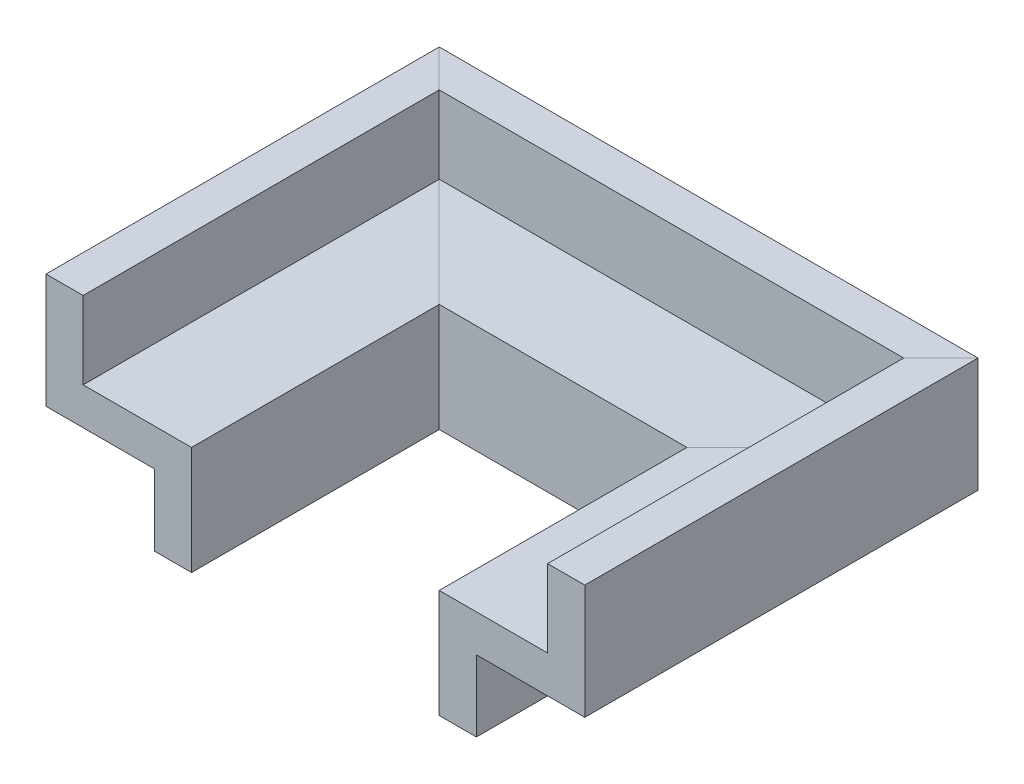
ISO-10303-21;
HEADER;
FILE_DESCRIPTION(('STEP AP214'),'2;1');
FILE_NAME('part.step','',(''),(''),'','','');
FILE_SCHEMA(('AUTOMOTIVE_DESIGN { 1 0 10303 214 1 1 1 1 }'));
ENDSEC;
DATA;
#1=APPLICATION_CONTEXT('core data for automotive mechanical design processes');
#2=APPLICATION_PROTOCOL_DEFINITION('international standard','automotive_design',2000,#1);
#3=PRODUCT_CONTEXT('',#1,'mechanical');
#4=PRODUCT('Part','Part','',(#3));
#5=PRODUCT_RELATED_PRODUCT_CATEGORY('part','',(#4));
#6=PRODUCT_DEFINITION_FORMATION('','',#4);
#7=PRODUCT_DEFINITION_CONTEXT('part definition',#1,'design');
#8=PRODUCT_DEFINITION('design','',#6,#7);
#9=PRODUCT_DEFINITION_SHAPE('','',#8);
#10=(LENGTH_UNIT() NAMED_UNIT(*) SI_UNIT(.MILLI.,.METRE.));
#11=(NAMED_UNIT(*) PLANE_ANGLE_UNIT() SI_UNIT($,.RADIAN.));
#12=(NAMED_UNIT(*) SI_UNIT($,.STERADIAN.) SOLID_ANGLE_UNIT());
#13=UNCERTAINTY_MEASURE_WITH_UNIT(LENGTH_MEASURE(1.E-05),#10,'distance_accuracy_value','');
#14=(GEOMETRIC_REPRESENTATION_CONTEXT(3) GLOBAL_UNCERTAINTY_ASSIGNED_CONTEXT((#13)) GLOBAL_UNIT_ASSIGNED_CONTEXT((#10,
#11,#12)) REPRESENTATION_CONTEXT('',''));
#15=CARTESIAN_POINT('',(0.,0.,0.));
#16=DIRECTION('',(0.,0.,1.));
#17=DIRECTION('',(1.,0.,0.));
#18=AXIS2_PLACEMENT_3D('',#15,#16,#17);
#19=CARTESIAN_POINT('',(80.,0.,0.));
#20=DIRECTION('',(0.,0.,-1.));
#21=DIRECTION('',(-1.,0.,0.));
#22=AXIS2_PLACEMENT_3D('',#19,#20,#21);
#23=PLANE('',#22);
#24=DIRECTION('',(-1.,0.,0.));
#25=VECTOR('',#24,1.);
#26=CARTESIAN_POINT('',(92.,0.,0.));
#27=LINE('',#26,#25);
#28=CARTESIAN_POINT('',(92.,0.,0.));
#29=VERTEX_POINT('',#28);
#30=CARTESIAN_POINT('',(80.,0.,0.));
#31=VERTEX_POINT('',#30);
#32=EDGE_CURVE('E111',#29,#31,#27,.T.);
#33=ORIENTED_EDGE('',*,*,#32,.F.);
#34=DIRECTION('',(0.,-1.,0.));
#35=VECTOR('',#34,1.);
#36=CARTESIAN_POINT('',(92.,23.,0.));
#37=LINE('',#36,#35);
#38=CARTESIAN_POINT('',(92.,23.,0.));
#39=VERTEX_POINT('',#38);
#40=EDGE_CURVE('E118',#39,#29,#37,.T.);
#41=ORIENTED_EDGE('',*,*,#40,.F.);
#42=DIRECTION('',(-1.,0.,0.));
#43=VECTOR('',#42,1.);
#44=CARTESIAN_POINT('',(127.,23.,0.));
#45=LINE('',#44,#43);
#46=CARTESIAN_POINT('',(127.,23.,0.));
#47=VERTEX_POINT('',#46);
#48=EDGE_CURVE('E127',#47,#39,#45,.T.);
#49=ORIENTED_EDGE('',*,*,#48,.F.);
#50=DIRECTION('',(0.,-1.,0.));
#51=VECTOR('',#50,1.);
#52=CARTESIAN_POINT('',(127.,60.,0.));
#53=LINE('',#52,#51);
#54=CARTESIAN_POINT('',(127.,60.,0.));
#55=VERTEX_POINT('',#54);
#56=EDGE_CURVE('E181',#55,#47,#53,.T.);
#57=ORIENTED_EDGE('',*,*,#56,.F.);
#58=DIRECTION('',(1.,0.,0.));
#59=VECTOR('',#58,1.);
#60=CARTESIAN_POINT('',(115.,60.,0.));
#61=LINE('',#60,#59);
#62=CARTESIAN_POINT('',(115.,60.,0.));
#63=VERTEX_POINT('',#62);
#64=EDGE_CURVE('E178',#63,#55,#61,.T.);
#65=ORIENTED_EDGE('',*,*,#64,.F.);
#66=DIRECTION('',(0.,1.,0.));
#67=VECTOR('',#66,1.);
#68=CARTESIAN_POINT('',(115.,35.,0.));
#69=LINE('',#68,#67);
#70=CARTESIAN_POINT('',(115.,35.,0.));
#71=VERTEX_POINT('',#70);
#72=EDGE_CURVE('E175',#71,#63,#69,.T.);
#73=ORIENTED_EDGE('',*,*,#72,.F.);
#74=DIRECTION('',(1.,0.,0.));
#75=VECTOR('',#74,1.);
#76=CARTESIAN_POINT('',(80.,35.,0.));
#77=LINE('',#76,#75);
#78=CARTESIAN_POINT('',(80.,35.,0.));
#79=VERTEX_POINT('',#78);
#80=EDGE_CURVE('E172',#79,#71,#77,.T.);
#81=ORIENTED_EDGE('',*,*,#80,.F.);
#82=DIRECTION('',(0.,1.,0.));
#83=VECTOR('',#82,1.);
#84=CARTESIAN_POINT('',(80.,0.,0.));
#85=LINE('',#84,#83);
#86=EDGE_CURVE('E130',#31,#79,#85,.T.);
#87=ORIENTED_EDGE('',*,*,#86,.F.);
#88=EDGE_LOOP('',(#33,#41,#49,#57,#65,#73,#81,#87));
#89=FACE_BOUND('',#88,.T.);
#90=ADVANCED_FACE('F39',(#89),#23,.F.);
#91=CARTESIAN_POINT('',(0.,0.,0.));
#92=DIRECTION('',(0.,0.,1.));
#93=DIRECTION('',(1.,0.,0.));
#94=AXIS2_PLACEMENT_3D('',#91,#92,#93);
#95=PLANE('',#94);
#96=DIRECTION('',(1.,0.,0.));
#97=VECTOR('',#96,1.);
#98=CARTESIAN_POINT('',(-12.,0.,0.));
#99=LINE('',#98,#97);
#100=CARTESIAN_POINT('',(-12.,0.,0.));
#101=VERTEX_POINT('',#100);
#102=CARTESIAN_POINT('',(0.,0.,0.));
#103=VERTEX_POINT('',#102);
#104=EDGE_CURVE('E240',#101,#103,#99,.T.);
#105=ORIENTED_EDGE('',*,*,#104,.T.);
#106=DIRECTION('',(0.,1.,0.));
#107=VECTOR('',#106,1.);
#108=CARTESIAN_POINT('',(0.,0.,0.));
#109=LINE('',#108,#107);
#110=CARTESIAN_POINT('',(0.,35.,0.));
#111=VERTEX_POINT('',#110);
#112=EDGE_CURVE('E292',#103,#111,#109,.T.);
#113=ORIENTED_EDGE('',*,*,#112,.T.);
#114=DIRECTION('',(-1.,0.,0.));
#115=VECTOR('',#114,1.);
#116=CARTESIAN_POINT('',(0.,35.,0.));
#117=LINE('',#116,#115);
#118=CARTESIAN_POINT('',(-35.,35.,0.));
#119=VERTEX_POINT('',#118);
#120=EDGE_CURVE('E284',#111,#119,#117,.T.);
#121=ORIENTED_EDGE('',*,*,#120,.T.);
#122=DIRECTION('',(0.,1.,0.));
#123=VECTOR('',#122,1.);
#124=CARTESIAN_POINT('',(-35.,35.,0.));
#125=LINE('',#124,#123);
#126=CARTESIAN_POINT('',(-35.,60.,0.));
#127=VERTEX_POINT('',#126);
#128=EDGE_CURVE('E276',#119,#127,#125,.T.);
#129=ORIENTED_EDGE('',*,*,#128,.T.);
#130=DIRECTION('',(-1.,0.,0.));
#131=VECTOR('',#130,1.);
#132=CARTESIAN_POINT('',(-35.,60.,0.));
#133=LINE('',#132,#131);
#134=CARTESIAN_POINT('',(-47.,60.,0.));
#135=VERTEX_POINT('',#134);
#136=EDGE_CURVE('E268',#127,#135,#133,.T.);
#137=ORIENTED_EDGE('',*,*,#136,.T.);
#138=DIRECTION('',(0.,-1.,0.));
#139=VECTOR('',#138,1.);
#140=CARTESIAN_POINT('',(-47.,60.,0.));
#141=LINE('',#140,#139);
#142=CARTESIAN_POINT('',(-47.,23.,0.));
#143=VERTEX_POINT('',#142);
#144=EDGE_CURVE('E260',#135,#143,#141,.T.);
#145=ORIENTED_EDGE('',*,*,#144,.T.);
#146=DIRECTION('',(1.,0.,0.));
#147=VECTOR('',#146,1.);
#148=CARTESIAN_POINT('',(-47.,23.,0.));
#149=LINE('',#148,#147);
#150=CARTESIAN_POINT('',(-12.,23.,0.));
#151=VERTEX_POINT('',#150);
#152=EDGE_CURVE('E252',#143,#151,#149,.T.);
#153=ORIENTED_EDGE('',*,*,#152,.T.);
#154=DIRECTION('',(0.,-1.,0.));
#155=VECTOR('',#154,1.);
#156=CARTESIAN_POINT('',(-12.,23.,0.));
#157=LINE('',#156,#155);
#158=EDGE_CURVE('E247',#151,#101,#157,.T.);
#159=ORIENTED_EDGE('',*,*,#158,.T.);
#160=EDGE_LOOP('',(#105,#113,#121,#129,#137,#145,#153,#159));
#161=FACE_BOUND('',#160,.T.);
#162=ADVANCED_FACE('F388',(#161),#95,.T.);
#163=CARTESIAN_POINT('',(92.,0.,-131.8));
#164=DIRECTION('',(0.,1.,0.));
#165=DIRECTION('',(0.,0.,1.));
#166=AXIS2_PLACEMENT_3D('',#163,#164,#165);
#167=PLANE('',#166);
#168=DIRECTION('',(0.707106781186548,0.,-0.707106781186548));
#169=VECTOR('',#168,1.);
#170=CARTESIAN_POINT('',(20.1,0.,-20.1));
#171=LINE('',#170,#169);
#172=CARTESIAN_POINT('',(80.,0.,-80.));
#173=VERTEX_POINT('',#172);
#174=CARTESIAN_POINT('',(92.,0.,-92.));
#175=VERTEX_POINT('',#174);
#176=EDGE_CURVE('E135',#173,#175,#171,.T.);
#177=ORIENTED_EDGE('',*,*,#176,.T.);
#178=DIRECTION('',(0.,0.,1.));
#179=VECTOR('',#178,1.);
#180=CARTESIAN_POINT('',(92.,0.,-131.8));
#181=LINE('',#180,#179);
#182=EDGE_CURVE('E42',#175,#29,#181,.T.);
#183=ORIENTED_EDGE('',*,*,#182,.T.);
#184=ORIENTED_EDGE('',*,*,#32,.T.);
#185=DIRECTION('',(0.,0.,1.));
#186=VECTOR('',#185,1.);
#187=CARTESIAN_POINT('',(80.,0.,-131.8));
#188=LINE('',#187,#186);
#189=EDGE_CURVE('E139',#173,#31,#188,.T.);
#190=ORIENTED_EDGE('',*,*,#189,.F.);
#191=EDGE_LOOP('',(#177,#183,#184,#190));
#192=FACE_BOUND('',#191,.T.);
#193=ADVANCED_FACE('F134',(#192),#167,.F.);
#194=CARTESIAN_POINT('',(80.,0.,-131.8));
#195=DIRECTION('',(1.,0.,0.));
#196=DIRECTION('',(0.,0.,-1.));
#197=AXIS2_PLACEMENT_3D('',#194,#195,#196);
#198=PLANE('',#197);
#199=DIRECTION('',(0.,-1.,0.));
#200=VECTOR('',#199,1.);
#201=CARTESIAN_POINT('',(80.,0.,-80.));
#202=LINE('',#201,#200);
#203=CARTESIAN_POINT('',(80.,35.,-80.));
#204=VERTEX_POINT('',#203);
#205=EDGE_CURVE('E237',#204,#173,#202,.T.);
#206=ORIENTED_EDGE('',*,*,#205,.T.);
#207=ORIENTED_EDGE('',*,*,#189,.T.);
#208=ORIENTED_EDGE('',*,*,#86,.T.);
#209=DIRECTION('',(0.,0.,1.));
#210=VECTOR('',#209,1.);
#211=CARTESIAN_POINT('',(80.,35.,-131.8));
#212=LINE('',#211,#210);
#213=EDGE_CURVE('E145',#204,#79,#212,.T.);
#214=ORIENTED_EDGE('',*,*,#213,.F.);
#215=EDGE_LOOP('',(#206,#207,#208,#214));
#216=FACE_BOUND('',#215,.T.);
#217=ADVANCED_FACE('F400',(#216),#198,.F.);
#218=CARTESIAN_POINT('',(80.,35.,-131.8));
#219=DIRECTION('',(0.,-1.,0.));
#220=DIRECTION('',(1.,0.,0.));
#221=AXIS2_PLACEMENT_3D('',#218,#219,#220);
#222=PLANE('',#221);
#223=DIRECTION('',(-0.707106781186548,0.,0.707106781186548));
#224=VECTOR('',#223,1.);
#225=CARTESIAN_POINT('',(14.1,35.,-14.1));
#226=LINE('',#225,#224);
#227=CARTESIAN_POINT('',(115.,35.,-115.));
#228=VERTEX_POINT('',#227);
#229=EDGE_CURVE('E233',#228,#204,#226,.T.);
#230=ORIENTED_EDGE('',*,*,#229,.T.);
#231=ORIENTED_EDGE('',*,*,#213,.T.);
#232=ORIENTED_EDGE('',*,*,#80,.T.);
#233=DIRECTION('',(0.,0.,1.));
#234=VECTOR('',#233,1.);
#235=CARTESIAN_POINT('',(115.,35.,-131.8));
#236=LINE('',#235,#234);
#237=EDGE_CURVE('E150',#228,#71,#236,.T.);
#238=ORIENTED_EDGE('',*,*,#237,.F.);
#239=EDGE_LOOP('',(#230,#231,#232,#238));
#240=FACE_BOUND('',#239,.T.);
#241=ADVANCED_FACE('F403',(#240),#222,.F.);
#242=CARTESIAN_POINT('',(115.,35.,-131.8));
#243=DIRECTION('',(1.,0.,0.));
#244=DIRECTION('',(0.,0.,-1.));
#245=AXIS2_PLACEMENT_3D('',#242,#243,#244);
#246=PLANE('',#245);
#247=DIRECTION('',(0.,-1.,0.));
#248=VECTOR('',#247,1.);
#249=CARTESIAN_POINT('',(115.,35.,-115.));
#250=LINE('',#249,#248);
#251=CARTESIAN_POINT('',(115.,60.,-115.));
#252=VERTEX_POINT('',#251);
#253=EDGE_CURVE('E229',#252,#228,#250,.T.);
#254=ORIENTED_EDGE('',*,*,#253,.T.);
#255=ORIENTED_EDGE('',*,*,#237,.T.);
#256=ORIENTED_EDGE('',*,*,#72,.T.);
#257=DIRECTION('',(0.,0.,1.));
#258=VECTOR('',#257,1.);
#259=CARTESIAN_POINT('',(115.,60.,-131.8));
#260=LINE('',#259,#258);
#261=EDGE_CURVE('E156',#252,#63,#260,.T.);
#262=ORIENTED_EDGE('',*,*,#261,.F.);
#263=EDGE_LOOP('',(#254,#255,#256,#262));
#264=FACE_BOUND('',#263,.T.);
#265=ADVANCED_FACE('F406',(#264),#246,.F.);
#266=CARTESIAN_POINT('',(115.,60.,-131.8));
#267=DIRECTION('',(0.,-1.,0.));
#268=DIRECTION('',(0.,0.,-1.));
#269=AXIS2_PLACEMENT_3D('',#266,#267,#268);
#270=PLANE('',#269);
#271=DIRECTION('',(-0.707106781186548,0.,0.707106781186548));
#272=VECTOR('',#271,1.);
#273=CARTESIAN_POINT('',(31.6,60.,-31.6));
#274=LINE('',#273,#272);
#275=CARTESIAN_POINT('',(127.,60.,-127.));
#276=VERTEX_POINT('',#275);
#277=EDGE_CURVE('E225',#276,#252,#274,.T.);
#278=ORIENTED_EDGE('',*,*,#277,.T.);
#279=ORIENTED_EDGE('',*,*,#261,.T.);
#280=ORIENTED_EDGE('',*,*,#64,.T.);
#281=DIRECTION('',(0.,0.,1.));
#282=VECTOR('',#281,1.);
#283=CARTESIAN_POINT('',(127.,60.,-131.8));
#284=LINE('',#283,#282);
#285=EDGE_CURVE('E160',#276,#55,#284,.T.);
#286=ORIENTED_EDGE('',*,*,#285,.F.);
#287=EDGE_LOOP('',(#278,#279,#280,#286));
#288=FACE_BOUND('',#287,.T.);
#289=ADVANCED_FACE('F410',(#288),#270,.F.);
#290=CARTESIAN_POINT('',(127.,60.,-131.8));
#291=DIRECTION('',(-1.,0.,0.));
#292=DIRECTION('',(0.,-1.,0.));
#293=AXIS2_PLACEMENT_3D('',#290,#291,#292);
#294=PLANE('',#293);
#295=DIRECTION('',(0.,1.,0.));
#296=VECTOR('',#295,1.);
#297=CARTESIAN_POINT('',(127.,60.,-127.));
#298=LINE('',#297,#296);
#299=CARTESIAN_POINT('',(127.,23.,-127.));
#300=VERTEX_POINT('',#299);
#301=EDGE_CURVE('E221',#300,#276,#298,.T.);
#302=ORIENTED_EDGE('',*,*,#301,.T.);
#303=ORIENTED_EDGE('',*,*,#285,.T.);
#304=ORIENTED_EDGE('',*,*,#56,.T.);
#305=DIRECTION('',(0.,0.,1.));
#306=VECTOR('',#305,1.);
#307=CARTESIAN_POINT('',(127.,23.,-131.8));
#308=LINE('',#307,#306);
#309=EDGE_CURVE('E164',#300,#47,#308,.T.);
#310=ORIENTED_EDGE('',*,*,#309,.F.);
#311=EDGE_LOOP('',(#302,#303,#304,#310));
#312=FACE_BOUND('',#311,.T.);
#313=ADVANCED_FACE('F414',(#312),#294,.F.);
#314=CARTESIAN_POINT('',(127.,23.,-131.8));
#315=DIRECTION('',(0.,1.,0.));
#316=DIRECTION('',(0.,0.,1.));
#317=AXIS2_PLACEMENT_3D('',#314,#315,#316);
#318=PLANE('',#317);
#319=DIRECTION('',(0.707106781186548,0.,-0.707106781186548));
#320=VECTOR('',#319,1.);
#321=CARTESIAN_POINT('',(37.6,23.,-37.6));
#322=LINE('',#321,#320);
#323=CARTESIAN_POINT('',(91.9999999999999,23.,-92.));
#324=VERTEX_POINT('',#323);
#325=EDGE_CURVE('E217',#324,#300,#322,.T.);
#326=ORIENTED_EDGE('',*,*,#325,.T.);
#327=ORIENTED_EDGE('',*,*,#309,.T.);
#328=ORIENTED_EDGE('',*,*,#48,.T.);
#329=DIRECTION('',(0.,0.,1.));
#330=VECTOR('',#329,1.);
#331=CARTESIAN_POINT('',(92.,23.,-131.8));
#332=LINE('',#331,#330);
#333=EDGE_CURVE('E123',#324,#39,#332,.T.);
#334=ORIENTED_EDGE('',*,*,#333,.F.);
#335=EDGE_LOOP('',(#326,#327,#328,#334));
#336=FACE_BOUND('',#335,.T.);
#337=ADVANCED_FACE('F433',(#336),#318,.F.);
#338=CARTESIAN_POINT('',(92.,23.,-131.8));
#339=DIRECTION('',(-1.,0.,0.));
#340=DIRECTION('',(0.,-1.,0.));
#341=AXIS2_PLACEMENT_3D('',#338,#339,#340);
#342=PLANE('',#341);
#343=DIRECTION('',(0.,1.,0.));
#344=VECTOR('',#343,1.);
#345=CARTESIAN_POINT('',(92.,23.,-92.));
#346=LINE('',#345,#344);
#347=EDGE_CURVE('E188',#175,#324,#346,.T.);
#348=ORIENTED_EDGE('',*,*,#347,.T.);
#349=ORIENTED_EDGE('',*,*,#333,.T.);
#350=ORIENTED_EDGE('',*,*,#40,.T.);
#351=ORIENTED_EDGE('',*,*,#182,.F.);
#352=EDGE_LOOP('',(#348,#349,#350,#351));
#353=FACE_BOUND('',#352,.T.);
#354=ADVANCED_FACE('F120',(#353),#342,.F.);
#355=CARTESIAN_POINT('',(-51.8,23.,-92.));
#356=DIRECTION('',(0.,0.,1.));
#357=DIRECTION('',(0.,-1.,0.));
#358=AXIS2_PLACEMENT_3D('',#355,#356,#357);
#359=PLANE('',#358);
#360=DIRECTION('',(1.,0.,0.));
#361=VECTOR('',#360,1.);
#362=CARTESIAN_POINT('',(-51.8,0.,-92.));
#363=LINE('',#362,#361);
#364=CARTESIAN_POINT('',(-12.,0.,-92.));
#365=VERTEX_POINT('',#364);
#366=EDGE_CURVE('E189',#365,#175,#363,.T.);
#367=ORIENTED_EDGE('',*,*,#366,.F.);
#368=DIRECTION('',(0.,1.,0.));
#369=VECTOR('',#368,1.);
#370=CARTESIAN_POINT('',(-12.,23.,-92.));
#371=LINE('',#370,#369);
#372=CARTESIAN_POINT('',(-12.,23.,-92.));
#373=VERTEX_POINT('',#372);
#374=EDGE_CURVE('E245',#365,#373,#371,.T.);
#375=ORIENTED_EDGE('',*,*,#374,.T.);
#376=DIRECTION('',(1.,0.,0.));
#377=VECTOR('',#376,1.);
#378=CARTESIAN_POINT('',(-51.8,23.,-92.));
#379=LINE('',#378,#377);
#380=EDGE_CURVE('E138',#373,#324,#379,.T.);
#381=ORIENTED_EDGE('',*,*,#380,.T.);
#382=ORIENTED_EDGE('',*,*,#347,.F.);
#383=EDGE_LOOP('',(#367,#375,#381,#382));
#384=FACE_BOUND('',#383,.T.);
#385=ADVANCED_FACE('F429',(#384),#359,.F.);
#386=CARTESIAN_POINT('',(-51.8,23.,-127.));
#387=DIRECTION('',(0.,1.,0.));
#388=DIRECTION('',(0.,0.,1.));
#389=AXIS2_PLACEMENT_3D('',#386,#387,#388);
#390=PLANE('',#389);
#391=ORIENTED_EDGE('',*,*,#380,.F.);
#392=DIRECTION('',(-0.707106781186548,0.,-0.707106781186548));
#393=VECTOR('',#392,1.);
#394=CARTESIAN_POINT('',(16.5,23.,-63.5));
#395=LINE('',#394,#393);
#396=CARTESIAN_POINT('',(-47.,23.,-127.));
#397=VERTEX_POINT('',#396);
#398=EDGE_CURVE('E311',#373,#397,#395,.T.);
#399=ORIENTED_EDGE('',*,*,#398,.T.);
#400=DIRECTION('',(1.,0.,0.));
#401=VECTOR('',#400,1.);
#402=CARTESIAN_POINT('',(-51.8,23.,-127.));
#403=LINE('',#402,#401);
#404=EDGE_CURVE('E143',#397,#300,#403,.T.);
#405=ORIENTED_EDGE('',*,*,#404,.T.);
#406=ORIENTED_EDGE('',*,*,#325,.F.);
#407=EDGE_LOOP('',(#391,#399,#405,#406));
#408=FACE_BOUND('',#407,.T.);
#409=ADVANCED_FACE('F431',(#408),#390,.F.);
#410=CARTESIAN_POINT('',(-51.8,60.,-127.));
#411=DIRECTION('',(0.,0.,1.));
#412=DIRECTION('',(0.,-1.,0.));
#413=AXIS2_PLACEMENT_3D('',#410,#411,#412);
#414=PLANE('',#413);
#415=ORIENTED_EDGE('',*,*,#404,.F.);
#416=DIRECTION('',(0.,1.,0.));
#417=VECTOR('',#416,1.);
#418=CARTESIAN_POINT('',(-47.,60.,-127.));
#419=LINE('',#418,#417);
#420=CARTESIAN_POINT('',(-47.,60.,-127.));
#421=VERTEX_POINT('',#420);
#422=EDGE_CURVE('E315',#397,#421,#419,.T.);
#423=ORIENTED_EDGE('',*,*,#422,.T.);
#424=DIRECTION('',(1.,0.,0.));
#425=VECTOR('',#424,1.);
#426=CARTESIAN_POINT('',(-51.8,60.,-127.));
#427=LINE('',#426,#425);
#428=EDGE_CURVE('E208',#421,#276,#427,.T.);
#429=ORIENTED_EDGE('',*,*,#428,.T.);
#430=ORIENTED_EDGE('',*,*,#301,.F.);
#431=EDGE_LOOP('',(#415,#423,#429,#430));
#432=FACE_BOUND('',#431,.T.);
#433=ADVANCED_FACE('F417',(#432),#414,.F.);
#434=CARTESIAN_POINT('',(-51.8,60.,-115.));
#435=DIRECTION('',(0.,-1.,0.));
#436=DIRECTION('',(0.,0.,-1.));
#437=AXIS2_PLACEMENT_3D('',#434,#435,#436);
#438=PLANE('',#437);
#439=ORIENTED_EDGE('',*,*,#428,.F.);
#440=DIRECTION('',(0.707106781186548,0.,0.707106781186548));
#441=VECTOR('',#440,1.);
#442=CARTESIAN_POINT('',(22.5,60.,-57.5));
#443=LINE('',#442,#441);
#444=CARTESIAN_POINT('',(-35.,60.,-115.));
#445=VERTEX_POINT('',#444);
#446=EDGE_CURVE('E319',#421,#445,#443,.T.);
#447=ORIENTED_EDGE('',*,*,#446,.T.);
#448=DIRECTION('',(1.,0.,0.));
#449=VECTOR('',#448,1.);
#450=CARTESIAN_POINT('',(-51.8,60.,-115.));
#451=LINE('',#450,#449);
#452=EDGE_CURVE('E204',#445,#252,#451,.T.);
#453=ORIENTED_EDGE('',*,*,#452,.T.);
#454=ORIENTED_EDGE('',*,*,#277,.F.);
#455=EDGE_LOOP('',(#439,#447,#453,#454));
#456=FACE_BOUND('',#455,.T.);
#457=ADVANCED_FACE('F383',(#456),#438,.F.);
#458=CARTESIAN_POINT('',(-51.8,35.,-115.));
#459=DIRECTION('',(0.,0.,-1.));
#460=DIRECTION('',(-1.,0.,0.));
#461=AXIS2_PLACEMENT_3D('',#458,#459,#460);
#462=PLANE('',#461);
#463=ORIENTED_EDGE('',*,*,#452,.F.);
#464=DIRECTION('',(0.,-1.,0.));
#465=VECTOR('',#464,1.);
#466=CARTESIAN_POINT('',(-35.,35.,-115.));
#467=LINE('',#466,#465);
#468=CARTESIAN_POINT('',(-35.,35.,-115.));
#469=VERTEX_POINT('',#468);
#470=EDGE_CURVE('E323',#445,#469,#467,.T.);
#471=ORIENTED_EDGE('',*,*,#470,.T.);
#472=DIRECTION('',(1.,0.,0.));
#473=VECTOR('',#472,1.);
#474=CARTESIAN_POINT('',(-51.8,35.,-115.));
#475=LINE('',#474,#473);
#476=EDGE_CURVE('E200',#469,#228,#475,.T.);
#477=ORIENTED_EDGE('',*,*,#476,.T.);
#478=ORIENTED_EDGE('',*,*,#253,.F.);
#479=EDGE_LOOP('',(#463,#471,#477,#478));
#480=FACE_BOUND('',#479,.T.);
#481=ADVANCED_FACE('F379',(#480),#462,.F.);
#482=CARTESIAN_POINT('',(-51.8,35.,-80.));
#483=DIRECTION('',(0.,-1.,0.));
#484=DIRECTION('',(0.,0.,-1.));
#485=AXIS2_PLACEMENT_3D('',#482,#483,#484);
#486=PLANE('',#485);
#487=ORIENTED_EDGE('',*,*,#476,.F.);
#488=DIRECTION('',(0.707106781186548,0.,0.707106781186548));
#489=VECTOR('',#488,1.);
#490=CARTESIAN_POINT('',(40.,35.,-40.));
#491=LINE('',#490,#489);
#492=CARTESIAN_POINT('',(0.,35.,-80.));
#493=VERTEX_POINT('',#492);
#494=EDGE_CURVE('E49',#469,#493,#491,.T.);
#495=ORIENTED_EDGE('',*,*,#494,.T.);
#496=DIRECTION('',(1.,0.,0.));
#497=VECTOR('',#496,1.);
#498=CARTESIAN_POINT('',(-51.8,35.,-80.));
#499=LINE('',#498,#497);
#500=EDGE_CURVE('E196',#493,#204,#499,.T.);
#501=ORIENTED_EDGE('',*,*,#500,.T.);
#502=ORIENTED_EDGE('',*,*,#229,.F.);
#503=EDGE_LOOP('',(#487,#495,#501,#502));
#504=FACE_BOUND('',#503,.T.);
#505=ADVANCED_FACE('F331',(#504),#486,.F.);
#506=CARTESIAN_POINT('',(-51.8,0.,-80.));
#507=DIRECTION('',(0.,0.,-1.));
#508=DIRECTION('',(-1.,0.,0.));
#509=AXIS2_PLACEMENT_3D('',#506,#507,#508);
#510=PLANE('',#509);
#511=ORIENTED_EDGE('',*,*,#500,.F.);
#512=DIRECTION('',(0.,-1.,0.));
#513=VECTOR('',#512,1.);
#514=CARTESIAN_POINT('',(0.,0.,-80.));
#515=LINE('',#514,#513);
#516=CARTESIAN_POINT('',(0.,0.,-80.));
#517=VERTEX_POINT('',#516);
#518=EDGE_CURVE('E11',#493,#517,#515,.T.);
#519=ORIENTED_EDGE('',*,*,#518,.T.);
#520=DIRECTION('',(1.,0.,0.));
#521=VECTOR('',#520,1.);
#522=CARTESIAN_POINT('',(-51.8,0.,-80.));
#523=LINE('',#522,#521);
#524=EDGE_CURVE('E192',#517,#173,#523,.T.);
#525=ORIENTED_EDGE('',*,*,#524,.T.);
#526=ORIENTED_EDGE('',*,*,#205,.F.);
#527=EDGE_LOOP('',(#511,#519,#525,#526));
#528=FACE_BOUND('',#527,.T.);
#529=ADVANCED_FACE('F398',(#528),#510,.F.);
#530=CARTESIAN_POINT('',(-51.8,0.,-92.));
#531=DIRECTION('',(0.,1.,0.));
#532=DIRECTION('',(0.,0.,1.));
#533=AXIS2_PLACEMENT_3D('',#530,#531,#532);
#534=PLANE('',#533);
#535=ORIENTED_EDGE('',*,*,#524,.F.);
#536=DIRECTION('',(-0.707106781186548,0.,-0.707106781186548));
#537=VECTOR('',#536,1.);
#538=CARTESIAN_POINT('',(34.,0.,-46.));
#539=LINE('',#538,#537);
#540=EDGE_CURVE('E241',#517,#365,#539,.T.);
#541=ORIENTED_EDGE('',*,*,#540,.T.);
#542=ORIENTED_EDGE('',*,*,#366,.T.);
#543=ORIENTED_EDGE('',*,*,#176,.F.);
#544=EDGE_LOOP('',(#535,#541,#542,#543));
#545=FACE_BOUND('',#544,.T.);
#546=ADVANCED_FACE('F396',(#545),#534,.F.);
#547=CARTESIAN_POINT('',(-12.,23.,0.));
#548=DIRECTION('',(1.,0.,0.));
#549=DIRECTION('',(0.,1.,0.));
#550=AXIS2_PLACEMENT_3D('',#547,#548,#549);
#551=PLANE('',#550);
#552=DIRECTION('',(0.,0.,-1.));
#553=VECTOR('',#552,1.);
#554=CARTESIAN_POINT('',(-12.,0.,0.));
#555=LINE('',#554,#553);
#556=EDGE_CURVE('E251',#101,#365,#555,.T.);
#557=ORIENTED_EDGE('',*,*,#556,.F.);
#558=ORIENTED_EDGE('',*,*,#158,.F.);
#559=DIRECTION('',(0.,0.,-1.));
#560=VECTOR('',#559,1.);
#561=CARTESIAN_POINT('',(-12.,23.,0.));
#562=LINE('',#561,#560);
#563=EDGE_CURVE('E246',#151,#373,#562,.T.);
#564=ORIENTED_EDGE('',*,*,#563,.T.);
#565=ORIENTED_EDGE('',*,*,#374,.F.);
#566=EDGE_LOOP('',(#557,#558,#564,#565));
#567=FACE_BOUND('',#566,.T.);
#568=ADVANCED_FACE('F426',(#567),#551,.F.);
#569=CARTESIAN_POINT('',(-47.,23.,0.));
#570=DIRECTION('',(0.,1.,0.));
#571=DIRECTION('',(0.,0.,1.));
#572=AXIS2_PLACEMENT_3D('',#569,#570,#571);
#573=PLANE('',#572);
#574=ORIENTED_EDGE('',*,*,#563,.F.);
#575=ORIENTED_EDGE('',*,*,#152,.F.);
#576=DIRECTION('',(0.,0.,-1.));
#577=VECTOR('',#576,1.);
#578=CARTESIAN_POINT('',(-47.,23.,0.));
#579=LINE('',#578,#577);
#580=EDGE_CURVE('E256',#143,#397,#579,.T.);
#581=ORIENTED_EDGE('',*,*,#580,.T.);
#582=ORIENTED_EDGE('',*,*,#398,.F.);
#583=EDGE_LOOP('',(#574,#575,#581,#582));
#584=FACE_BOUND('',#583,.T.);
#585=ADVANCED_FACE('F423',(#584),#573,.F.);
#586=CARTESIAN_POINT('',(-47.,60.,0.));
#587=DIRECTION('',(1.,0.,0.));
#588=DIRECTION('',(0.,1.,0.));
#589=AXIS2_PLACEMENT_3D('',#586,#587,#588);
#590=PLANE('',#589);
#591=ORIENTED_EDGE('',*,*,#580,.F.);
#592=ORIENTED_EDGE('',*,*,#144,.F.);
#593=DIRECTION('',(0.,0.,-1.));
#594=VECTOR('',#593,1.);
#595=CARTESIAN_POINT('',(-47.,60.,0.));
#596=LINE('',#595,#594);
#597=EDGE_CURVE('E264',#135,#421,#596,.T.);
#598=ORIENTED_EDGE('',*,*,#597,.T.);
#599=ORIENTED_EDGE('',*,*,#422,.F.);
#600=EDGE_LOOP('',(#591,#592,#598,#599));
#601=FACE_BOUND('',#600,.T.);
#602=ADVANCED_FACE('F420',(#601),#590,.F.);
#603=CARTESIAN_POINT('',(-35.,60.,0.));
#604=DIRECTION('',(0.,-1.,0.));
#605=DIRECTION('',(0.,0.,-1.));
#606=AXIS2_PLACEMENT_3D('',#603,#604,#605);
#607=PLANE('',#606);
#608=ORIENTED_EDGE('',*,*,#597,.F.);
#609=ORIENTED_EDGE('',*,*,#136,.F.);
#610=DIRECTION('',(0.,0.,-1.));
#611=VECTOR('',#610,1.);
#612=CARTESIAN_POINT('',(-35.,60.,0.));
#613=LINE('',#612,#611);
#614=EDGE_CURVE('E272',#127,#445,#613,.T.);
#615=ORIENTED_EDGE('',*,*,#614,.T.);
#616=ORIENTED_EDGE('',*,*,#446,.F.);
#617=EDGE_LOOP('',(#608,#609,#615,#616));
#618=FACE_BOUND('',#617,.T.);
#619=ADVANCED_FACE('F386',(#618),#607,.F.);
#620=CARTESIAN_POINT('',(-35.,35.,0.));
#621=DIRECTION('',(-1.,0.,0.));
#622=DIRECTION('',(0.,0.,1.));
#623=AXIS2_PLACEMENT_3D('',#620,#621,#622);
#624=PLANE('',#623);
#625=ORIENTED_EDGE('',*,*,#614,.F.);
#626=ORIENTED_EDGE('',*,*,#128,.F.);
#627=DIRECTION('',(0.,0.,-1.));
#628=VECTOR('',#627,1.);
#629=CARTESIAN_POINT('',(-35.,35.,0.));
#630=LINE('',#629,#628);
#631=EDGE_CURVE('E280',#119,#469,#630,.T.);
#632=ORIENTED_EDGE('',*,*,#631,.T.);
#633=ORIENTED_EDGE('',*,*,#470,.F.);
#634=EDGE_LOOP('',(#625,#626,#632,#633));
#635=FACE_BOUND('',#634,.T.);
#636=ADVANCED_FACE('F377',(#635),#624,.F.);
#637=CARTESIAN_POINT('',(0.,35.,0.));
#638=DIRECTION('',(0.,-1.,0.));
#639=DIRECTION('',(1.,0.,0.));
#640=AXIS2_PLACEMENT_3D('',#637,#638,#639);
#641=PLANE('',#640);
#642=ORIENTED_EDGE('',*,*,#631,.F.);
#643=ORIENTED_EDGE('',*,*,#120,.F.);
#644=DIRECTION('',(0.,0.,-1.));
#645=VECTOR('',#644,1.);
#646=CARTESIAN_POINT('',(0.,35.,0.));
#647=LINE('',#646,#645);
#648=EDGE_CURVE('E288',#111,#493,#647,.T.);
#649=ORIENTED_EDGE('',*,*,#648,.T.);
#650=ORIENTED_EDGE('',*,*,#494,.F.);
#651=EDGE_LOOP('',(#642,#643,#649,#650));
#652=FACE_BOUND('',#651,.T.);
#653=ADVANCED_FACE('F335',(#652),#641,.F.);
#654=CARTESIAN_POINT('',(0.,0.,0.));
#655=DIRECTION('',(-1.,0.,0.));
#656=DIRECTION('',(0.,0.,1.));
#657=AXIS2_PLACEMENT_3D('',#654,#655,#656);
#658=PLANE('',#657);
#659=ORIENTED_EDGE('',*,*,#648,.F.);
#660=ORIENTED_EDGE('',*,*,#112,.F.);
#661=DIRECTION('',(0.,0.,-1.));
#662=VECTOR('',#661,1.);
#663=CARTESIAN_POINT('',(0.,0.,0.));
#664=LINE('',#663,#662);
#665=EDGE_CURVE('E296',#103,#517,#664,.T.);
#666=ORIENTED_EDGE('',*,*,#665,.T.);
#667=ORIENTED_EDGE('',*,*,#518,.F.);
#668=EDGE_LOOP('',(#659,#660,#666,#667));
#669=FACE_BOUND('',#668,.T.);
#670=ADVANCED_FACE('F338',(#669),#658,.F.);
#671=CARTESIAN_POINT('',(-12.,0.,0.));
#672=DIRECTION('',(0.,1.,0.));
#673=DIRECTION('',(0.,0.,1.));
#674=AXIS2_PLACEMENT_3D('',#671,#672,#673);
#675=PLANE('',#674);
#676=ORIENTED_EDGE('',*,*,#665,.F.);
#677=ORIENTED_EDGE('',*,*,#104,.F.);
#678=ORIENTED_EDGE('',*,*,#556,.T.);
#679=ORIENTED_EDGE('',*,*,#540,.F.);
#680=EDGE_LOOP('',(#676,#677,#678,#679));
#681=FACE_BOUND('',#680,.T.);
#682=ADVANCED_FACE('F393',(#681),#675,.F.);
#683=CLOSED_SHELL('',(#90,#162,#193,#217,#241,#265,#289,#313,#337,#354,#385,#409,#433,#457,#481,
#505,#529,#546,#568,#585,#602,#619,#636,#653,#670,#682));
#684=MANIFOLD_SOLID_BREP('B2',#683);
#685=ADVANCED_BREP_SHAPE_REPRESENTATION('',(#18,#684),#14);
#686=SHAPE_DEFINITION_REPRESENTATION(#9,#685);
ENDSEC;
END-ISO-10303-21;
